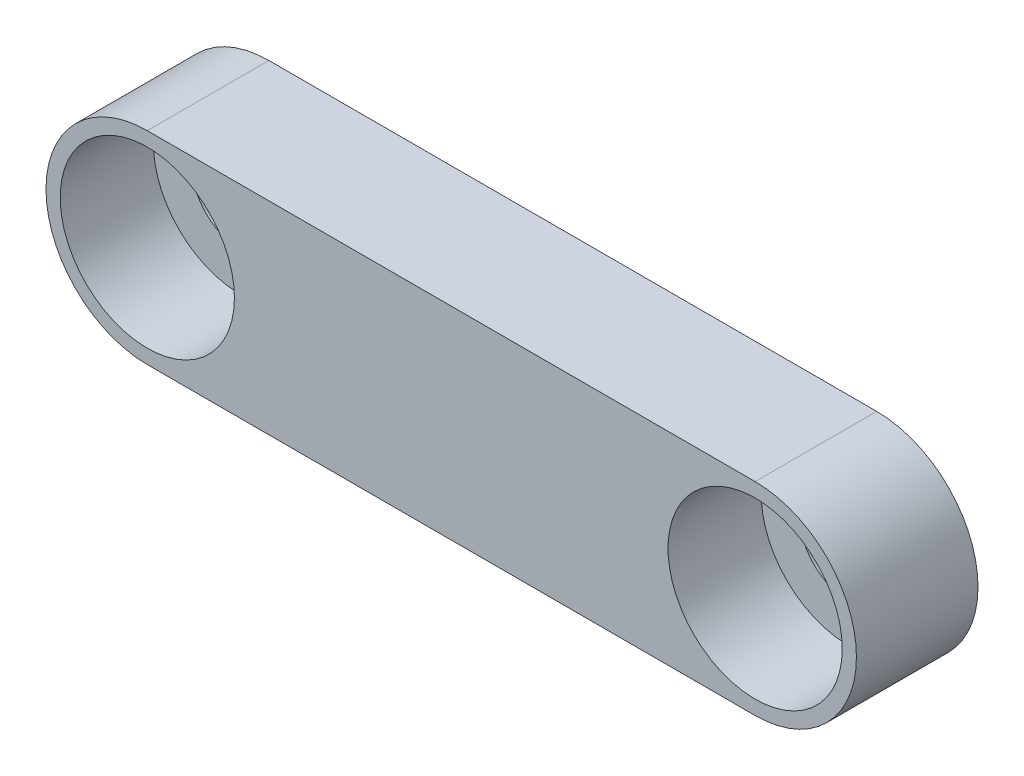
ISO-10303-21;
HEADER;
FILE_DESCRIPTION(('STEP AP214'),'2;1');
FILE_NAME('part.step','',(''),(''),'','','');
FILE_SCHEMA(('AUTOMOTIVE_DESIGN { 1 0 10303 214 1 1 1 1 }'));
ENDSEC;
DATA;
#1=APPLICATION_CONTEXT('core data for automotive mechanical design processes');
#2=APPLICATION_PROTOCOL_DEFINITION('international standard','automotive_design',2000,#1);
#3=PRODUCT_CONTEXT('',#1,'mechanical');
#4=PRODUCT('Part','Part','',(#3));
#5=PRODUCT_RELATED_PRODUCT_CATEGORY('part','',(#4));
#6=PRODUCT_DEFINITION_FORMATION('','',#4);
#7=PRODUCT_DEFINITION_CONTEXT('part definition',#1,'design');
#8=PRODUCT_DEFINITION('design','',#6,#7);
#9=PRODUCT_DEFINITION_SHAPE('','',#8);
#10=(LENGTH_UNIT() NAMED_UNIT(*) SI_UNIT(.MILLI.,.METRE.));
#11=(NAMED_UNIT(*) PLANE_ANGLE_UNIT() SI_UNIT($,.RADIAN.));
#12=(NAMED_UNIT(*) SI_UNIT($,.STERADIAN.) SOLID_ANGLE_UNIT());
#13=UNCERTAINTY_MEASURE_WITH_UNIT(LENGTH_MEASURE(1.E-05),#10,'distance_accuracy_value','');
#14=(GEOMETRIC_REPRESENTATION_CONTEXT(3) GLOBAL_UNCERTAINTY_ASSIGNED_CONTEXT((#13)) GLOBAL_UNIT_ASSIGNED_CONTEXT((#10,
#11,#12)) REPRESENTATION_CONTEXT('',''));
#15=CARTESIAN_POINT('',(0.,0.,0.));
#16=DIRECTION('',(0.,0.,1.));
#17=DIRECTION('',(1.,0.,0.));
#18=AXIS2_PLACEMENT_3D('',#15,#16,#17);
#19=CARTESIAN_POINT('',(-7.5,0.,3.));
#20=DIRECTION('',(0.,0.,-1.));
#21=DIRECTION('',(-1.,0.,0.));
#22=AXIS2_PLACEMENT_3D('',#19,#20,#21);
#23=CYLINDRICAL_SURFACE('',#22,2.5);
#24=CARTESIAN_POINT('',(-7.5,0.,0.));
#25=DIRECTION('',(0.,0.,1.));
#26=DIRECTION('',(1.,0.,0.));
#27=AXIS2_PLACEMENT_3D('',#24,#25,#26);
#28=CIRCLE('',#27,2.5);
#29=CARTESIAN_POINT('',(-7.5,2.5,0.));
#30=VERTEX_POINT('',#29);
#31=CARTESIAN_POINT('',(-7.5,-2.5,0.));
#32=VERTEX_POINT('',#31);
#33=EDGE_CURVE('E116',#30,#32,#28,.T.);
#34=ORIENTED_EDGE('',*,*,#33,.T.);
#35=DIRECTION('',(0.,0.,-1.));
#36=VECTOR('',#35,1.);
#37=CARTESIAN_POINT('',(-7.5,-2.5,3.));
#38=LINE('',#37,#36);
#39=CARTESIAN_POINT('',(-7.5,-2.5,3.));
#40=VERTEX_POINT('',#39);
#41=EDGE_CURVE('E11',#40,#32,#38,.T.);
#42=ORIENTED_EDGE('',*,*,#41,.F.);
#43=CARTESIAN_POINT('',(-7.5,0.,3.));
#44=DIRECTION('',(0.,0.,1.));
#45=DIRECTION('',(1.,0.,0.));
#46=AXIS2_PLACEMENT_3D('',#43,#44,#45);
#47=CIRCLE('',#46,2.5);
#48=CARTESIAN_POINT('',(-7.5,2.5,3.));
#49=VERTEX_POINT('',#48);
#50=EDGE_CURVE('E96',#49,#40,#47,.T.);
#51=ORIENTED_EDGE('',*,*,#50,.F.);
#52=DIRECTION('',(0.,0.,-1.));
#53=VECTOR('',#52,1.);
#54=CARTESIAN_POINT('',(-7.5,2.5,3.));
#55=LINE('',#54,#53);
#56=EDGE_CURVE('E112',#49,#30,#55,.T.);
#57=ORIENTED_EDGE('',*,*,#56,.T.);
#58=EDGE_LOOP('',(#34,#42,#51,#57));
#59=FACE_BOUND('',#58,.T.);
#60=ADVANCED_FACE('F42',(#59),#23,.T.);
#61=CARTESIAN_POINT('',(-7.5,-2.5,3.));
#62=DIRECTION('',(0.,1.,0.));
#63=DIRECTION('',(-1.,0.,0.));
#64=AXIS2_PLACEMENT_3D('',#61,#62,#63);
#65=PLANE('',#64);
#66=DIRECTION('',(1.,0.,0.));
#67=VECTOR('',#66,1.);
#68=CARTESIAN_POINT('',(-7.5,-2.5,0.));
#69=LINE('',#68,#67);
#70=CARTESIAN_POINT('',(7.5,-2.5,0.));
#71=VERTEX_POINT('',#70);
#72=EDGE_CURVE('E101',#32,#71,#69,.T.);
#73=ORIENTED_EDGE('',*,*,#72,.T.);
#74=DIRECTION('',(0.,0.,-1.));
#75=VECTOR('',#74,1.);
#76=CARTESIAN_POINT('',(7.5,-2.5,3.));
#77=LINE('',#76,#75);
#78=CARTESIAN_POINT('',(7.5,-2.5,3.));
#79=VERTEX_POINT('',#78);
#80=EDGE_CURVE('E52',#79,#71,#77,.T.);
#81=ORIENTED_EDGE('',*,*,#80,.F.);
#82=DIRECTION('',(1.,0.,0.));
#83=VECTOR('',#82,1.);
#84=CARTESIAN_POINT('',(-7.5,-2.5,3.));
#85=LINE('',#84,#83);
#86=EDGE_CURVE('E91',#40,#79,#85,.T.);
#87=ORIENTED_EDGE('',*,*,#86,.F.);
#88=ORIENTED_EDGE('',*,*,#41,.T.);
#89=EDGE_LOOP('',(#73,#81,#87,#88));
#90=FACE_BOUND('',#89,.T.);
#91=ADVANCED_FACE('F100',(#90),#65,.F.);
#92=CARTESIAN_POINT('',(7.5,0.,3.));
#93=DIRECTION('',(0.,0.,-1.));
#94=DIRECTION('',(-1.,0.,0.));
#95=AXIS2_PLACEMENT_3D('',#92,#93,#94);
#96=CYLINDRICAL_SURFACE('',#95,2.5);
#97=CARTESIAN_POINT('',(7.5,0.,0.));
#98=DIRECTION('',(0.,0.,1.));
#99=DIRECTION('',(1.,0.,0.));
#100=AXIS2_PLACEMENT_3D('',#97,#98,#99);
#101=CIRCLE('',#100,2.5);
#102=CARTESIAN_POINT('',(7.5,2.5,0.));
#103=VERTEX_POINT('',#102);
#104=EDGE_CURVE('E78',#71,#103,#101,.T.);
#105=ORIENTED_EDGE('',*,*,#104,.T.);
#106=DIRECTION('',(0.,0.,-1.));
#107=VECTOR('',#106,1.);
#108=CARTESIAN_POINT('',(7.5,2.5,3.));
#109=LINE('',#108,#107);
#110=CARTESIAN_POINT('',(7.5,2.5,3.));
#111=VERTEX_POINT('',#110);
#112=EDGE_CURVE('E103',#111,#103,#109,.T.);
#113=ORIENTED_EDGE('',*,*,#112,.F.);
#114=CARTESIAN_POINT('',(7.5,0.,3.));
#115=DIRECTION('',(0.,0.,1.));
#116=DIRECTION('',(1.,0.,0.));
#117=AXIS2_PLACEMENT_3D('',#114,#115,#116);
#118=CIRCLE('',#117,2.5);
#119=EDGE_CURVE('E94',#79,#111,#118,.T.);
#120=ORIENTED_EDGE('',*,*,#119,.F.);
#121=ORIENTED_EDGE('',*,*,#80,.T.);
#122=EDGE_LOOP('',(#105,#113,#120,#121));
#123=FACE_BOUND('',#122,.T.);
#124=ADVANCED_FACE('F105',(#123),#96,.T.);
#125=CARTESIAN_POINT('',(-7.5,2.5,3.));
#126=DIRECTION('',(0.,-1.,0.));
#127=DIRECTION('',(1.,0.,0.));
#128=AXIS2_PLACEMENT_3D('',#125,#126,#127);
#129=PLANE('',#128);
#130=DIRECTION('',(-1.,0.,0.));
#131=VECTOR('',#130,1.);
#132=CARTESIAN_POINT('',(-7.5,2.5,0.));
#133=LINE('',#132,#131);
#134=EDGE_CURVE('E84',#103,#30,#133,.T.);
#135=ORIENTED_EDGE('',*,*,#134,.T.);
#136=ORIENTED_EDGE('',*,*,#56,.F.);
#137=DIRECTION('',(-1.,0.,0.));
#138=VECTOR('',#137,1.);
#139=CARTESIAN_POINT('',(-7.5,2.5,3.));
#140=LINE('',#139,#138);
#141=EDGE_CURVE('E61',#111,#49,#140,.T.);
#142=ORIENTED_EDGE('',*,*,#141,.F.);
#143=ORIENTED_EDGE('',*,*,#112,.T.);
#144=EDGE_LOOP('',(#135,#136,#142,#143));
#145=FACE_BOUND('',#144,.T.);
#146=ADVANCED_FACE('F206',(#145),#129,.F.);
#147=CARTESIAN_POINT('',(-7.5,0.,3.));
#148=DIRECTION('',(0.,0.,1.));
#149=DIRECTION('',(1.,0.,0.));
#150=AXIS2_PLACEMENT_3D('',#147,#148,#149);
#151=PLANE('',#150);
#152=CARTESIAN_POINT('',(-7.5,0.,3.));
#153=DIRECTION('',(0.,0.,1.));
#154=DIRECTION('',(1.,0.,0.));
#155=AXIS2_PLACEMENT_3D('',#152,#153,#154);
#156=CIRCLE('',#155,2.15);
#157=CARTESIAN_POINT('',(-5.35,0.,3.));
#158=VERTEX_POINT('',#157);
#159=EDGE_CURVE('E164',#158,#158,#156,.T.);
#160=ORIENTED_EDGE('',*,*,#159,.F.);
#161=EDGE_LOOP('',(#160));
#162=FACE_BOUND('',#161,.T.);
#163=CARTESIAN_POINT('',(7.5,0.,3.));
#164=DIRECTION('',(0.,0.,1.));
#165=DIRECTION('',(1.,0.,0.));
#166=AXIS2_PLACEMENT_3D('',#163,#164,#165);
#167=CIRCLE('',#166,2.15);
#168=CARTESIAN_POINT('',(9.65,0.,3.));
#169=VERTEX_POINT('',#168);
#170=EDGE_CURVE('E146',#169,#169,#167,.T.);
#171=ORIENTED_EDGE('',*,*,#170,.F.);
#172=EDGE_LOOP('',(#171));
#173=FACE_BOUND('',#172,.T.);
#174=ORIENTED_EDGE('',*,*,#50,.T.);
#175=ORIENTED_EDGE('',*,*,#86,.T.);
#176=ORIENTED_EDGE('',*,*,#119,.T.);
#177=ORIENTED_EDGE('',*,*,#141,.T.);
#178=EDGE_LOOP('',(#174,#175,#176,#177));
#179=FACE_BOUND('',#178,.T.);
#180=ADVANCED_FACE('F92',(#162,#173,#179),#151,.T.);
#181=CARTESIAN_POINT('',(-7.5,0.,0.));
#182=DIRECTION('',(0.,0.,1.));
#183=DIRECTION('',(1.,0.,0.));
#184=AXIS2_PLACEMENT_3D('',#181,#182,#183);
#185=PLANE('',#184);
#186=CARTESIAN_POINT('',(-7.5,0.,0.));
#187=DIRECTION('',(0.,0.,1.));
#188=DIRECTION('',(1.,0.,0.));
#189=AXIS2_PLACEMENT_3D('',#186,#187,#188);
#190=CIRCLE('',#189,1.2);
#191=CARTESIAN_POINT('',(-6.3,0.,0.));
#192=VERTEX_POINT('',#191);
#193=EDGE_CURVE('E45',#192,#192,#190,.T.);
#194=ORIENTED_EDGE('',*,*,#193,.T.);
#195=EDGE_LOOP('',(#194));
#196=FACE_BOUND('',#195,.T.);
#197=CARTESIAN_POINT('',(7.5,0.,0.));
#198=DIRECTION('',(0.,0.,1.));
#199=DIRECTION('',(1.,0.,0.));
#200=AXIS2_PLACEMENT_3D('',#197,#198,#199);
#201=CIRCLE('',#200,1.2);
#202=CARTESIAN_POINT('',(8.7,0.,0.));
#203=VERTEX_POINT('',#202);
#204=EDGE_CURVE('E120',#203,#203,#201,.T.);
#205=ORIENTED_EDGE('',*,*,#204,.T.);
#206=EDGE_LOOP('',(#205));
#207=FACE_BOUND('',#206,.T.);
#208=ORIENTED_EDGE('',*,*,#33,.F.);
#209=ORIENTED_EDGE('',*,*,#134,.F.);
#210=ORIENTED_EDGE('',*,*,#104,.F.);
#211=ORIENTED_EDGE('',*,*,#72,.F.);
#212=EDGE_LOOP('',(#208,#209,#210,#211));
#213=FACE_BOUND('',#212,.T.);
#214=ADVANCED_FACE('F205',(#196,#207,#213),#185,.F.);
#215=CARTESIAN_POINT('',(7.5,0.,3.));
#216=DIRECTION('',(0.,0.,1.));
#217=DIRECTION('',(1.,0.,0.));
#218=AXIS2_PLACEMENT_3D('',#215,#216,#217);
#219=CYLINDRICAL_SURFACE('',#218,1.2);
#220=CARTESIAN_POINT('',(7.5,0.,0.7));
#221=DIRECTION('',(0.,0.,1.));
#222=DIRECTION('',(1.,0.,0.));
#223=AXIS2_PLACEMENT_3D('',#220,#221,#222);
#224=CIRCLE('',#223,1.2);
#225=CARTESIAN_POINT('',(8.7,0.,0.7));
#226=VERTEX_POINT('',#225);
#227=EDGE_CURVE('E132',#226,#226,#224,.T.);
#228=ORIENTED_EDGE('',*,*,#227,.T.);
#229=EDGE_LOOP('',(#228));
#230=FACE_BOUND('',#229,.T.);
#231=ORIENTED_EDGE('',*,*,#204,.F.);
#232=EDGE_LOOP('',(#231));
#233=FACE_BOUND('',#232,.T.);
#234=ADVANCED_FACE('F223',(#230,#233),#219,.F.);
#235=CARTESIAN_POINT('',(8.7,0.,0.7));
#236=DIRECTION('',(0.,0.,-1.));
#237=DIRECTION('',(-1.,0.,0.));
#238=AXIS2_PLACEMENT_3D('',#235,#236,#237);
#239=PLANE('',#238);
#240=ORIENTED_EDGE('',*,*,#227,.F.);
#241=EDGE_LOOP('',(#240));
#242=FACE_BOUND('',#241,.T.);
#243=CARTESIAN_POINT('',(7.5,0.,0.7));
#244=DIRECTION('',(0.,0.,1.));
#245=DIRECTION('',(1.,0.,0.));
#246=AXIS2_PLACEMENT_3D('',#243,#244,#245);
#247=CIRCLE('',#246,2.15);
#248=CARTESIAN_POINT('',(9.65,0.,0.7));
#249=VERTEX_POINT('',#248);
#250=EDGE_CURVE('E139',#249,#249,#247,.T.);
#251=ORIENTED_EDGE('',*,*,#250,.T.);
#252=EDGE_LOOP('',(#251));
#253=FACE_BOUND('',#252,.T.);
#254=ADVANCED_FACE('F213',(#242,#253),#239,.F.);
#255=CARTESIAN_POINT('',(7.5,0.,3.));
#256=DIRECTION('',(0.,0.,1.));
#257=DIRECTION('',(1.,0.,0.));
#258=AXIS2_PLACEMENT_3D('',#255,#256,#257);
#259=CYLINDRICAL_SURFACE('',#258,2.15);
#260=ORIENTED_EDGE('',*,*,#250,.F.);
#261=EDGE_LOOP('',(#260));
#262=FACE_BOUND('',#261,.T.);
#263=ORIENTED_EDGE('',*,*,#170,.T.);
#264=EDGE_LOOP('',(#263));
#265=FACE_BOUND('',#264,.T.);
#266=ADVANCED_FACE('F210',(#262,#265),#259,.F.);
#267=CARTESIAN_POINT('',(-7.5,0.,3.));
#268=DIRECTION('',(0.,0.,1.));
#269=DIRECTION('',(1.,0.,0.));
#270=AXIS2_PLACEMENT_3D('',#267,#268,#269);
#271=CYLINDRICAL_SURFACE('',#270,1.2);
#272=CARTESIAN_POINT('',(-7.5,0.,0.7));
#273=DIRECTION('',(0.,0.,1.));
#274=DIRECTION('',(1.,0.,0.));
#275=AXIS2_PLACEMENT_3D('',#272,#273,#274);
#276=CIRCLE('',#275,1.2);
#277=CARTESIAN_POINT('',(-6.3,0.,0.7));
#278=VERTEX_POINT('',#277);
#279=EDGE_CURVE('E163',#278,#278,#276,.T.);
#280=ORIENTED_EDGE('',*,*,#279,.T.);
#281=EDGE_LOOP('',(#280));
#282=FACE_BOUND('',#281,.T.);
#283=ORIENTED_EDGE('',*,*,#193,.F.);
#284=EDGE_LOOP('',(#283));
#285=FACE_BOUND('',#284,.T.);
#286=ADVANCED_FACE('F212',(#282,#285),#271,.F.);
#287=CARTESIAN_POINT('',(-6.3,0.,0.7));
#288=DIRECTION('',(0.,0.,-1.));
#289=DIRECTION('',(-1.,0.,0.));
#290=AXIS2_PLACEMENT_3D('',#287,#288,#289);
#291=PLANE('',#290);
#292=ORIENTED_EDGE('',*,*,#279,.F.);
#293=EDGE_LOOP('',(#292));
#294=FACE_BOUND('',#293,.T.);
#295=CARTESIAN_POINT('',(-7.5,0.,0.7));
#296=DIRECTION('',(0.,0.,1.));
#297=DIRECTION('',(1.,0.,0.));
#298=AXIS2_PLACEMENT_3D('',#295,#296,#297);
#299=CIRCLE('',#298,2.15);
#300=CARTESIAN_POINT('',(-5.35,0.,0.7));
#301=VERTEX_POINT('',#300);
#302=EDGE_CURVE('E160',#301,#301,#299,.T.);
#303=ORIENTED_EDGE('',*,*,#302,.T.);
#304=EDGE_LOOP('',(#303));
#305=FACE_BOUND('',#304,.T.);
#306=ADVANCED_FACE('F220',(#294,#305),#291,.F.);
#307=CARTESIAN_POINT('',(-7.5,0.,3.));
#308=DIRECTION('',(0.,0.,1.));
#309=DIRECTION('',(1.,0.,0.));
#310=AXIS2_PLACEMENT_3D('',#307,#308,#309);
#311=CYLINDRICAL_SURFACE('',#310,2.15);
#312=ORIENTED_EDGE('',*,*,#302,.F.);
#313=EDGE_LOOP('',(#312));
#314=FACE_BOUND('',#313,.T.);
#315=ORIENTED_EDGE('',*,*,#159,.T.);
#316=EDGE_LOOP('',(#315));
#317=FACE_BOUND('',#316,.T.);
#318=ADVANCED_FACE('F201',(#314,#317),#311,.F.);
#319=CLOSED_SHELL('',(#60,#91,#124,#146,#180,#214,#234,#254,#266,#286,#306,#318));
#320=MANIFOLD_SOLID_BREP('B2',#319);
#321=ADVANCED_BREP_SHAPE_REPRESENTATION('',(#18,#320),#14);
#322=SHAPE_DEFINITION_REPRESENTATION(#9,#321);
ENDSEC;
END-ISO-10303-21;
